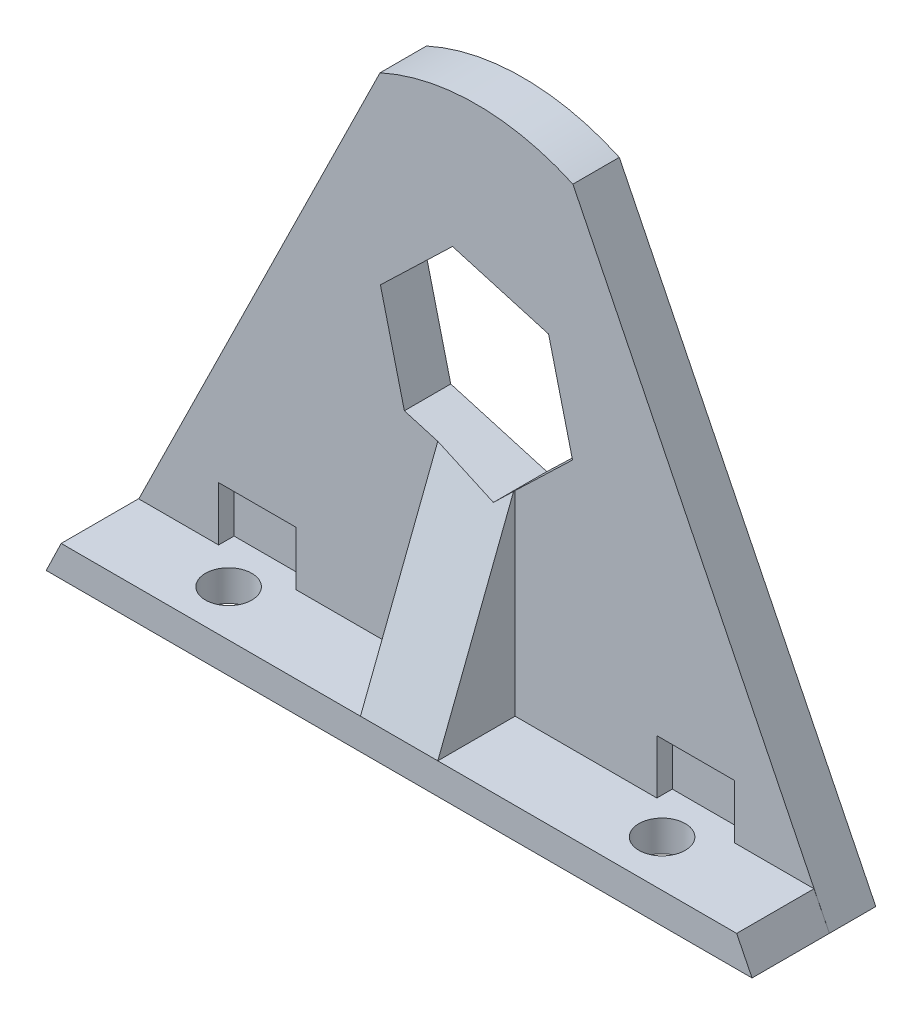
ISO-10303-21;
HEADER;
FILE_DESCRIPTION(('STEP AP214'),'2;1');
FILE_NAME('part.step','',(''),(''),'','','');
FILE_SCHEMA(('AUTOMOTIVE_DESIGN { 1 0 10303 214 1 1 1 1 }'));
ENDSEC;
DATA;
#1=APPLICATION_CONTEXT('core data for automotive mechanical design processes');
#2=APPLICATION_PROTOCOL_DEFINITION('international standard','automotive_design',2000,#1);
#3=PRODUCT_CONTEXT('',#1,'mechanical');
#4=PRODUCT('Part','Part','',(#3));
#5=PRODUCT_RELATED_PRODUCT_CATEGORY('part','',(#4));
#6=PRODUCT_DEFINITION_FORMATION('','',#4);
#7=PRODUCT_DEFINITION_CONTEXT('part definition',#1,'design');
#8=PRODUCT_DEFINITION('design','',#6,#7);
#9=PRODUCT_DEFINITION_SHAPE('','',#8);
#10=(LENGTH_UNIT() NAMED_UNIT(*) SI_UNIT(.MILLI.,.METRE.));
#11=(NAMED_UNIT(*) PLANE_ANGLE_UNIT() SI_UNIT($,.RADIAN.));
#12=(NAMED_UNIT(*) SI_UNIT($,.STERADIAN.) SOLID_ANGLE_UNIT());
#13=UNCERTAINTY_MEASURE_WITH_UNIT(LENGTH_MEASURE(1.E-05),#10,'distance_accuracy_value','');
#14=(GEOMETRIC_REPRESENTATION_CONTEXT(3) GLOBAL_UNCERTAINTY_ASSIGNED_CONTEXT((#13)) GLOBAL_UNIT_ASSIGNED_CONTEXT((#10,
#11,#12)) REPRESENTATION_CONTEXT('',''));
#15=CARTESIAN_POINT('',(0.,0.,0.));
#16=DIRECTION('',(0.,0.,1.));
#17=DIRECTION('',(1.,0.,0.));
#18=AXIS2_PLACEMENT_3D('',#15,#16,#17);
#19=CARTESIAN_POINT('',(0.,0.,0.));
#20=DIRECTION('',(0.,0.,1.));
#21=DIRECTION('',(1.,0.,0.));
#22=AXIS2_PLACEMENT_3D('',#19,#20,#21);
#23=PLANE('',#22);
#24=DIRECTION('',(0.960575743858647,-0.278018417214413,0.));
#25=VECTOR('',#24,1.);
#26=CARTESIAN_POINT('',(-4.66259965644607,-17.2203457207053,0.));
#27=LINE('',#26,#25);
#28=CARTESIAN_POINT('',(-4.66259965644607,-17.2203457207053,0.));
#29=VERTEX_POINT('',#28);
#30=CARTESIAN_POINT('',(1.54879338364465,-19.0181026105115,0.));
#31=VERTEX_POINT('',#30);
#32=EDGE_CURVE('E311',#29,#31,#27,.T.);
#33=ORIENTED_EDGE('',*,*,#32,.T.);
#34=DIRECTION('',(0.721058883956946,0.692873787833516,0.));
#35=VECTOR('',#34,1.);
#36=CARTESIAN_POINT('',(1.54879338364465,-19.0181026105115,0.));
#37=LINE('',#36,#35);
#38=CARTESIAN_POINT('',(6.21139304009072,-14.5377568898062,0.));
#39=VERTEX_POINT('',#38);
#40=EDGE_CURVE('E296',#31,#39,#37,.T.);
#41=ORIENTED_EDGE('',*,*,#40,.T.);
#42=DIRECTION('',(-0.239516859901701,0.970892205047929,0.));
#43=VECTOR('',#42,1.);
#44=CARTESIAN_POINT('',(6.21139304009072,-14.5377568898062,0.));
#45=LINE('',#44,#43);
#46=CARTESIAN_POINT('',(4.66259965644607,-8.25965427929471,0.));
#47=VERTEX_POINT('',#46);
#48=EDGE_CURVE('E299',#39,#47,#45,.T.);
#49=ORIENTED_EDGE('',*,*,#48,.T.);
#50=DIRECTION('',(-0.960575743858647,0.278018417214413,0.));
#51=VECTOR('',#50,1.);
#52=CARTESIAN_POINT('',(4.66259965644607,-8.25965427929471,0.));
#53=LINE('',#52,#51);
#54=CARTESIAN_POINT('',(-1.54879338364465,-6.46189738948846,0.));
#55=VERTEX_POINT('',#54);
#56=EDGE_CURVE('E302',#47,#55,#53,.T.);
#57=ORIENTED_EDGE('',*,*,#56,.T.);
#58=DIRECTION('',(-0.721058883956946,-0.692873787833516,0.));
#59=VECTOR('',#58,1.);
#60=CARTESIAN_POINT('',(-1.54879338364465,-6.46189738948846,0.));
#61=LINE('',#60,#59);
#62=CARTESIAN_POINT('',(-6.21139304009072,-10.9422431101938,0.));
#63=VERTEX_POINT('',#62);
#64=EDGE_CURVE('E305',#55,#63,#61,.T.);
#65=ORIENTED_EDGE('',*,*,#64,.T.);
#66=DIRECTION('',(0.239516859901701,-0.970892205047929,0.));
#67=VECTOR('',#66,1.);
#68=CARTESIAN_POINT('',(-6.21139304009072,-10.9422431101938,0.));
#69=LINE('',#68,#67);
#70=EDGE_CURVE('E308',#63,#29,#69,.T.);
#71=ORIENTED_EDGE('',*,*,#70,.T.);
#72=EDGE_LOOP('',(#33,#41,#49,#57,#65,#71));
#73=FACE_BOUND('',#72,.T.);
#74=DIRECTION('',(-0.441971259606871,-0.897029211164004,0.));
#75=VECTOR('',#74,1.);
#76=CARTESIAN_POINT('',(-5.38217526698402,2.65182755764123,0.));
#77=LINE('',#76,#75);
#78=CARTESIAN_POINT('',(-6.23517921956288,0.920562354147691,0.));
#79=VERTEX_POINT('',#78);
#80=CARTESIAN_POINT('',(-22.8199246855813,-32.74,0.));
#81=VERTEX_POINT('',#80);
#82=EDGE_CURVE('E409',#79,#81,#77,.T.);
#83=ORIENTED_EDGE('',*,*,#82,.F.);
#84=CARTESIAN_POINT('',(0.,-12.74,0.));
#85=DIRECTION('',(0.,0.,1.));
#86=DIRECTION('',(1.,0.,0.));
#87=AXIS2_PLACEMENT_3D('',#84,#85,#86);
#88=CIRCLE('',#87,15.0162719651592);
#89=CARTESIAN_POINT('',(6.23517921956288,0.920562354147692,0.));
#90=VERTEX_POINT('',#89);
#91=EDGE_CURVE('E293',#79,#90,#88,.F.);
#92=ORIENTED_EDGE('',*,*,#91,.T.);
#93=DIRECTION('',(-0.441971259606872,0.897029211164004,0.));
#94=VECTOR('',#93,1.);
#95=CARTESIAN_POINT('',(5.38217526698402,2.65182755764123,0.));
#96=LINE('',#95,#94);
#97=CARTESIAN_POINT('',(22.8199246855813,-32.74,0.));
#98=VERTEX_POINT('',#97);
#99=EDGE_CURVE('E401',#98,#90,#96,.T.);
#100=ORIENTED_EDGE('',*,*,#99,.F.);
#101=DIRECTION('',(1.,0.,0.));
#102=VECTOR('',#101,1.);
#103=CARTESIAN_POINT('',(-22.8199246855813,-32.74,0.));
#104=LINE('',#103,#102);
#105=EDGE_CURVE('E406',#81,#98,#104,.T.);
#106=ORIENTED_EDGE('',*,*,#105,.F.);
#107=EDGE_LOOP('',(#83,#92,#100,#106));
#108=FACE_BOUND('',#107,.T.);
#109=ADVANCED_FACE('F40',(#73,#108),#23,.F.);
#110=CARTESIAN_POINT('',(21.8241930023884,-30.74,8.));
#111=DIRECTION('',(-0.895190076131968,-0.445684560642212,0.));
#112=DIRECTION('',(0.445684560642212,-0.895190076131968,0.));
#113=AXIS2_PLACEMENT_3D('',#110,#111,#112);
#114=PLANE('',#113);
#115=DIRECTION('',(0.445684560642212,-0.895190076131968,0.));
#116=VECTOR('',#115,1.);
#117=CARTESIAN_POINT('',(21.8241930023884,-30.74,3.));
#118=LINE('',#117,#116);
#119=CARTESIAN_POINT('',(21.8241930023884,-30.74,3.));
#120=VERTEX_POINT('',#119);
#121=CARTESIAN_POINT('',(22.8199246855813,-32.74,3.));
#122=VERTEX_POINT('',#121);
#123=EDGE_CURVE('E364',#120,#122,#118,.T.);
#124=ORIENTED_EDGE('',*,*,#123,.F.);
#125=DIRECTION('',(0.,0.,-1.));
#126=VECTOR('',#125,1.);
#127=CARTESIAN_POINT('',(21.8241930023884,-30.74,8.));
#128=LINE('',#127,#126);
#129=CARTESIAN_POINT('',(21.8241930023884,-30.74,8.));
#130=VERTEX_POINT('',#129);
#131=EDGE_CURVE('E394',#130,#120,#128,.T.);
#132=ORIENTED_EDGE('',*,*,#131,.F.);
#133=DIRECTION('',(-0.445684560642212,0.895190076131968,0.));
#134=VECTOR('',#133,1.);
#135=CARTESIAN_POINT('',(21.8241930023884,-30.74,8.));
#136=LINE('',#135,#134);
#137=CARTESIAN_POINT('',(22.8199246855813,-32.74,8.));
#138=VERTEX_POINT('',#137);
#139=EDGE_CURVE('E382',#138,#130,#136,.T.);
#140=ORIENTED_EDGE('',*,*,#139,.F.);
#141=DIRECTION('',(0.,0.,-1.));
#142=VECTOR('',#141,1.);
#143=CARTESIAN_POINT('',(22.8199246855813,-32.74,8.));
#144=LINE('',#143,#142);
#145=EDGE_CURVE('E396',#138,#122,#144,.T.);
#146=ORIENTED_EDGE('',*,*,#145,.T.);
#147=EDGE_LOOP('',(#124,#132,#140,#146));
#148=FACE_BOUND('',#147,.T.);
#149=ADVANCED_FACE('F470',(#148),#114,.F.);
#150=CARTESIAN_POINT('',(-21.8516656723651,-30.74,8.));
#151=DIRECTION('',(0.,-1.,0.));
#152=DIRECTION('',(0.,0.,-1.));
#153=AXIS2_PLACEMENT_3D('',#150,#151,#152);
#154=PLANE('',#153);
#155=CARTESIAN_POINT('',(14.0138484452087,-30.74,5.01113147451422));
#156=DIRECTION('',(0.,-1.,0.));
#157=DIRECTION('',(0.,0.,-1.));
#158=AXIS2_PLACEMENT_3D('',#155,#156,#157);
#159=CIRCLE('',#158,1.5);
#160=CARTESIAN_POINT('',(14.0138484452087,-30.74,3.51113147451422));
#161=VERTEX_POINT('',#160);
#162=EDGE_CURVE('E283',#161,#161,#159,.T.);
#163=ORIENTED_EDGE('',*,*,#162,.T.);
#164=EDGE_LOOP('',(#163));
#165=FACE_BOUND('',#164,.T.);
#166=DIRECTION('',(1.,0.,0.));
#167=VECTOR('',#166,1.);
#168=CARTESIAN_POINT('',(-21.8516656723651,-30.74,3.));
#169=LINE('',#168,#167);
#170=CARTESIAN_POINT('',(2.5,-30.74,3.));
#171=VERTEX_POINT('',#170);
#172=CARTESIAN_POINT('',(11.6629495542711,-30.74,3.));
#173=VERTEX_POINT('',#172);
#174=EDGE_CURVE('E361',#171,#173,#169,.T.);
#175=ORIENTED_EDGE('',*,*,#174,.F.);
#176=DIRECTION('',(0.,0.,1.));
#177=VECTOR('',#176,1.);
#178=CARTESIAN_POINT('',(2.5,-30.74,8.));
#179=LINE('',#178,#177);
#180=CARTESIAN_POINT('',(2.5,-30.74,8.));
#181=VERTEX_POINT('',#180);
#182=EDGE_CURVE('E372',#171,#181,#179,.T.);
#183=ORIENTED_EDGE('',*,*,#182,.T.);
#184=DIRECTION('',(-1.,0.,0.));
#185=VECTOR('',#184,1.);
#186=CARTESIAN_POINT('',(-21.8516656723651,-30.74,8.));
#187=LINE('',#186,#185);
#188=EDGE_CURVE('E385',#130,#181,#187,.T.);
#189=ORIENTED_EDGE('',*,*,#188,.F.);
#190=ORIENTED_EDGE('',*,*,#131,.T.);
#191=CARTESIAN_POINT('',(16.6740539143788,-30.74,3.));
#192=VERTEX_POINT('',#191);
#193=EDGE_CURVE('E216',#192,#120,#169,.T.);
#194=ORIENTED_EDGE('',*,*,#193,.F.);
#195=DIRECTION('',(0.,0.,1.));
#196=VECTOR('',#195,1.);
#197=CARTESIAN_POINT('',(16.6740539143788,-30.74,2.));
#198=LINE('',#197,#196);
#199=CARTESIAN_POINT('',(16.6740539143788,-30.74,2.));
#200=VERTEX_POINT('',#199);
#201=EDGE_CURVE('E55',#200,#192,#198,.T.);
#202=ORIENTED_EDGE('',*,*,#201,.F.);
#203=DIRECTION('',(1.,0.,0.));
#204=VECTOR('',#203,1.);
#205=CARTESIAN_POINT('',(16.6740539143788,-30.74,2.));
#206=LINE('',#205,#204);
#207=CARTESIAN_POINT('',(11.6629495542711,-30.74,2.));
#208=VERTEX_POINT('',#207);
#209=EDGE_CURVE('E213',#208,#200,#206,.T.);
#210=ORIENTED_EDGE('',*,*,#209,.F.);
#211=DIRECTION('',(0.,0.,1.));
#212=VECTOR('',#211,1.);
#213=CARTESIAN_POINT('',(11.6629495542711,-30.74,2.));
#214=LINE('',#213,#212);
#215=EDGE_CURVE('E242',#208,#173,#214,.T.);
#216=ORIENTED_EDGE('',*,*,#215,.T.);
#217=EDGE_LOOP('',(#175,#183,#189,#190,#194,#202,#210,#216));
#218=FACE_BOUND('',#217,.T.);
#219=ADVANCED_FACE('F211',(#165,#218),#154,.F.);
#220=CARTESIAN_POINT('',(2.5,-13.37,4.));
#221=DIRECTION('',(1.,0.,0.));
#222=DIRECTION('',(0.,0.,-1.));
#223=AXIS2_PLACEMENT_3D('',#220,#221,#222);
#224=PLANE('',#223);
#225=DIRECTION('',(0.,0.93235184345378,-0.361552264559825));
#226=VECTOR('',#225,1.);
#227=CARTESIAN_POINT('',(2.5,-14.2922314134759,1.62179844318767));
#228=LINE('',#227,#226);
#229=CARTESIAN_POINT('',(2.5,-18.1040772154291,3.09997590540382));
#230=VERTEX_POINT('',#229);
#231=EDGE_CURVE('E291',#181,#230,#228,.T.);
#232=ORIENTED_EDGE('',*,*,#231,.F.);
#233=ORIENTED_EDGE('',*,*,#182,.F.);
#234=DIRECTION('',(0.,1.,0.));
#235=VECTOR('',#234,1.);
#236=CARTESIAN_POINT('',(2.5,-13.37,3.));
#237=LINE('',#236,#235);
#238=CARTESIAN_POINT('',(2.5,-18.1040772154291,3.));
#239=VERTEX_POINT('',#238);
#240=EDGE_CURVE('E358',#171,#239,#237,.T.);
#241=ORIENTED_EDGE('',*,*,#240,.T.);
#242=DIRECTION('',(0.,0.,-1.));
#243=VECTOR('',#242,1.);
#244=CARTESIAN_POINT('',(2.5,-18.1040772154291,4.));
#245=LINE('',#244,#243);
#246=EDGE_CURVE('E317',#230,#239,#245,.T.);
#247=ORIENTED_EDGE('',*,*,#246,.F.);
#248=EDGE_LOOP('',(#232,#233,#241,#247));
#249=FACE_BOUND('',#248,.T.);
#250=ADVANCED_FACE('F458',(#249),#224,.T.);
#251=CARTESIAN_POINT('',(-2.5,-13.37,4.));
#252=DIRECTION('',(1.,0.,0.));
#253=DIRECTION('',(0.,0.,-1.));
#254=AXIS2_PLACEMENT_3D('',#251,#252,#253);
#255=PLANE('',#254);
#256=DIRECTION('',(0.,0.,1.));
#257=VECTOR('',#256,1.);
#258=CARTESIAN_POINT('',(-2.5,-30.74,8.));
#259=LINE('',#258,#257);
#260=CARTESIAN_POINT('',(-2.5,-30.74,3.));
#261=VERTEX_POINT('',#260);
#262=CARTESIAN_POINT('',(-2.5,-30.74,8.));
#263=VERTEX_POINT('',#262);
#264=EDGE_CURVE('E369',#261,#263,#259,.T.);
#265=ORIENTED_EDGE('',*,*,#264,.T.);
#266=DIRECTION('',(0.,-0.93235184345378,0.361552264559825));
#267=VECTOR('',#266,1.);
#268=CARTESIAN_POINT('',(-2.5,-17.8462646421413,3.));
#269=LINE('',#268,#267);
#270=CARTESIAN_POINT('',(-2.5,-17.8462646421413,3.));
#271=VERTEX_POINT('',#270);
#272=EDGE_CURVE('E286',#271,#263,#269,.T.);
#273=ORIENTED_EDGE('',*,*,#272,.F.);
#274=DIRECTION('',(0.,1.,0.));
#275=VECTOR('',#274,1.);
#276=CARTESIAN_POINT('',(-2.5,-13.37,3.));
#277=LINE('',#276,#275);
#278=EDGE_CURVE('E48',#261,#271,#277,.T.);
#279=ORIENTED_EDGE('',*,*,#278,.F.);
#280=EDGE_LOOP('',(#265,#273,#279));
#281=FACE_BOUND('',#280,.T.);
#282=ADVANCED_FACE('F508',(#281),#255,.F.);
#283=CARTESIAN_POINT('',(-14.0138479574089,-30.74,5.01113147451422));
#284=DIRECTION('',(0.,-1.,0.));
#285=DIRECTION('',(0.,0.,-1.));
#286=AXIS2_PLACEMENT_3D('',#283,#284,#285);
#287=CIRCLE('',#286,1.5);
#288=CARTESIAN_POINT('',(-14.0138479574089,-30.74,3.51113147451422));
#289=VERTEX_POINT('',#288);
#290=EDGE_CURVE('E277',#289,#289,#287,.T.);
#291=ORIENTED_EDGE('',*,*,#290,.T.);
#292=EDGE_LOOP('',(#291));
#293=FACE_BOUND('',#292,.T.);
#294=DIRECTION('',(1.,0.,0.));
#295=VECTOR('',#294,1.);
#296=CARTESIAN_POINT('',(-21.8516656723651,-30.74,3.));
#297=LINE('',#296,#295);
#298=CARTESIAN_POINT('',(-21.8345136106546,-30.74,3.));
#299=VERTEX_POINT('',#298);
#300=CARTESIAN_POINT('',(-16.6740539143788,-30.74,3.));
#301=VERTEX_POINT('',#300);
#302=EDGE_CURVE('E355',#299,#301,#297,.T.);
#303=ORIENTED_EDGE('',*,*,#302,.F.);
#304=DIRECTION('',(0.,0.,-1.));
#305=VECTOR('',#304,1.);
#306=CARTESIAN_POINT('',(-21.8345136106546,-30.74,8.));
#307=LINE('',#306,#305);
#308=CARTESIAN_POINT('',(-21.8345136106546,-30.74,2.));
#309=VERTEX_POINT('',#308);
#310=EDGE_CURVE('E367',#299,#309,#307,.T.);
#311=ORIENTED_EDGE('',*,*,#310,.T.);
#312=DIRECTION('',(-1.,0.,0.));
#313=VECTOR('',#312,1.);
#314=CARTESIAN_POINT('',(-21.8516656723651,-30.74,2.));
#315=LINE('',#314,#313);
#316=CARTESIAN_POINT('',(-21.8516656723651,-30.74,2.));
#317=VERTEX_POINT('',#316);
#318=EDGE_CURVE('E380',#309,#317,#315,.T.);
#319=ORIENTED_EDGE('',*,*,#318,.T.);
#320=DIRECTION('',(0.,0.,-1.));
#321=VECTOR('',#320,1.);
#322=CARTESIAN_POINT('',(-21.8516656723651,-30.74,8.));
#323=LINE('',#322,#321);
#324=CARTESIAN_POINT('',(-21.8516656723651,-30.74,8.));
#325=VERTEX_POINT('',#324);
#326=EDGE_CURVE('E387',#325,#317,#323,.T.);
#327=ORIENTED_EDGE('',*,*,#326,.F.);
#328=EDGE_CURVE('E384',#263,#325,#187,.T.);
#329=ORIENTED_EDGE('',*,*,#328,.F.);
#330=ORIENTED_EDGE('',*,*,#264,.F.);
#331=CARTESIAN_POINT('',(-11.6629495542711,-30.74,3.));
#332=VERTEX_POINT('',#331);
#333=EDGE_CURVE('E343',#332,#261,#297,.T.);
#334=ORIENTED_EDGE('',*,*,#333,.F.);
#335=DIRECTION('',(0.,0.,1.));
#336=VECTOR('',#335,1.);
#337=CARTESIAN_POINT('',(-11.6629495542711,-30.74,2.));
#338=LINE('',#337,#336);
#339=CARTESIAN_POINT('',(-11.6629495542711,-30.74,2.));
#340=VERTEX_POINT('',#339);
#341=EDGE_CURVE('E272',#340,#332,#338,.T.);
#342=ORIENTED_EDGE('',*,*,#341,.F.);
#343=DIRECTION('',(1.,0.,0.));
#344=VECTOR('',#343,1.);
#345=CARTESIAN_POINT('',(-16.6740539143788,-30.74,2.));
#346=LINE('',#345,#344);
#347=CARTESIAN_POINT('',(-16.6740539143788,-30.74,2.));
#348=VERTEX_POINT('',#347);
#349=EDGE_CURVE('E250',#348,#340,#346,.T.);
#350=ORIENTED_EDGE('',*,*,#349,.F.);
#351=DIRECTION('',(0.,0.,1.));
#352=VECTOR('',#351,1.);
#353=CARTESIAN_POINT('',(-16.6740539143788,-30.74,2.));
#354=LINE('',#353,#352);
#355=EDGE_CURVE('E260',#348,#301,#354,.T.);
#356=ORIENTED_EDGE('',*,*,#355,.T.);
#357=EDGE_LOOP('',(#303,#311,#319,#327,#329,#330,#334,#342,#350,#356));
#358=FACE_BOUND('',#357,.T.);
#359=ADVANCED_FACE('F493',(#293,#358),#154,.F.);
#360=CARTESIAN_POINT('',(5.38217526698402,2.65182755764123,2.));
#361=DIRECTION('',(-0.897029211164004,-0.441971259606872,0.));
#362=DIRECTION('',(0.441971259606872,-0.897029211164004,0.));
#363=AXIS2_PLACEMENT_3D('',#360,#361,#362);
#364=PLANE('',#363);
#365=ORIENTED_EDGE('',*,*,#99,.T.);
#366=DIRECTION('',(0.,0.,-1.));
#367=VECTOR('',#366,1.);
#368=CARTESIAN_POINT('',(6.23517921956288,0.920562354147694,3.));
#369=LINE('',#368,#367);
#370=CARTESIAN_POINT('',(6.23517921956288,0.920562354147694,3.));
#371=VERTEX_POINT('',#370);
#372=EDGE_CURVE('E341',#371,#90,#369,.T.);
#373=ORIENTED_EDGE('',*,*,#372,.F.);
#374=DIRECTION('',(0.441971259606872,-0.897029211164004,0.));
#375=VECTOR('',#374,1.);
#376=CARTESIAN_POINT('',(5.38217526698402,2.65182755764123,3.));
#377=LINE('',#376,#375);
#378=EDGE_CURVE('E337',#371,#122,#377,.T.);
#379=ORIENTED_EDGE('',*,*,#378,.T.);
#380=DIRECTION('',(0.,0.,-1.));
#381=VECTOR('',#380,1.);
#382=CARTESIAN_POINT('',(22.8199246855813,-32.74,2.));
#383=LINE('',#382,#381);
#384=EDGE_CURVE('E405',#122,#98,#383,.T.);
#385=ORIENTED_EDGE('',*,*,#384,.T.);
#386=EDGE_LOOP('',(#365,#373,#379,#385));
#387=FACE_BOUND('',#386,.T.);
#388=ADVANCED_FACE('F42',(#387),#364,.F.);
#389=CARTESIAN_POINT('',(-5.38217526698402,2.65182755764123,2.));
#390=DIRECTION('',(0.897029211164004,-0.441971259606871,0.));
#391=DIRECTION('',(0.441971259606871,0.897029211164004,0.));
#392=AXIS2_PLACEMENT_3D('',#389,#390,#391);
#393=PLANE('',#392);
#394=DIRECTION('',(0.,0.,-1.));
#395=VECTOR('',#394,1.);
#396=CARTESIAN_POINT('',(-6.23517921956288,0.920562354147695,3.));
#397=LINE('',#396,#395);
#398=CARTESIAN_POINT('',(-6.23517921956288,0.920562354147695,3.));
#399=VERTEX_POINT('',#398);
#400=EDGE_CURVE('E344',#399,#79,#397,.T.);
#401=ORIENTED_EDGE('',*,*,#400,.T.);
#402=ORIENTED_EDGE('',*,*,#82,.T.);
#403=DIRECTION('',(0.,0.,-1.));
#404=VECTOR('',#403,1.);
#405=CARTESIAN_POINT('',(-22.8199246855813,-32.74,2.));
#406=LINE('',#405,#404);
#407=CARTESIAN_POINT('',(-22.8199246855813,-32.74,2.));
#408=VERTEX_POINT('',#407);
#409=EDGE_CURVE('E414',#408,#81,#406,.T.);
#410=ORIENTED_EDGE('',*,*,#409,.F.);
#411=DIRECTION('',(-0.441971259606871,-0.897029211164004,0.));
#412=VECTOR('',#411,1.);
#413=CARTESIAN_POINT('',(-5.38217526698402,2.65182755764123,2.));
#414=LINE('',#413,#412);
#415=EDGE_CURVE('E402',#309,#408,#414,.T.);
#416=ORIENTED_EDGE('',*,*,#415,.F.);
#417=ORIENTED_EDGE('',*,*,#310,.F.);
#418=DIRECTION('',(0.441971259606871,0.897029211164004,0.));
#419=VECTOR('',#418,1.);
#420=CARTESIAN_POINT('',(-5.38217526698402,2.65182755764123,3.));
#421=LINE('',#420,#419);
#422=EDGE_CURVE('E332',#299,#399,#421,.T.);
#423=ORIENTED_EDGE('',*,*,#422,.T.);
#424=EDGE_LOOP('',(#401,#402,#410,#416,#417,#423));
#425=FACE_BOUND('',#424,.T.);
#426=ADVANCED_FACE('F488',(#425),#393,.F.);
#427=CARTESIAN_POINT('',(-22.8199246855813,-32.74,2.));
#428=DIRECTION('',(0.,1.,0.));
#429=DIRECTION('',(0.,0.,1.));
#430=AXIS2_PLACEMENT_3D('',#427,#428,#429);
#431=PLANE('',#430);
#432=CARTESIAN_POINT('',(-14.0138479574089,-32.74,5.01113147451422));
#433=DIRECTION('',(0.,-1.,0.));
#434=DIRECTION('',(0.,0.,-1.));
#435=AXIS2_PLACEMENT_3D('',#432,#433,#434);
#436=CIRCLE('',#435,1.5);
#437=CARTESIAN_POINT('',(-14.0138479574089,-32.74,3.51113147451422));
#438=VERTEX_POINT('',#437);
#439=EDGE_CURVE('E269',#438,#438,#436,.T.);
#440=ORIENTED_EDGE('',*,*,#439,.F.);
#441=EDGE_LOOP('',(#440));
#442=FACE_BOUND('',#441,.T.);
#443=CARTESIAN_POINT('',(14.0138484452087,-32.74,5.01113147451422));
#444=DIRECTION('',(0.,-1.,0.));
#445=DIRECTION('',(0.,0.,-1.));
#446=AXIS2_PLACEMENT_3D('',#443,#444,#445);
#447=CIRCLE('',#446,1.5);
#448=CARTESIAN_POINT('',(14.0138484452087,-32.74,3.51113147451422));
#449=VERTEX_POINT('',#448);
#450=EDGE_CURVE('E280',#449,#449,#447,.T.);
#451=ORIENTED_EDGE('',*,*,#450,.F.);
#452=EDGE_LOOP('',(#451));
#453=FACE_BOUND('',#452,.T.);
#454=ORIENTED_EDGE('',*,*,#384,.F.);
#455=ORIENTED_EDGE('',*,*,#145,.F.);
#456=DIRECTION('',(1.,0.,0.));
#457=VECTOR('',#456,1.);
#458=CARTESIAN_POINT('',(-22.8199246855813,-32.74,8.));
#459=LINE('',#458,#457);
#460=CARTESIAN_POINT('',(-22.8199246855813,-32.74,8.));
#461=VERTEX_POINT('',#460);
#462=EDGE_CURVE('E379',#461,#138,#459,.T.);
#463=ORIENTED_EDGE('',*,*,#462,.F.);
#464=DIRECTION('',(0.,0.,-1.));
#465=VECTOR('',#464,1.);
#466=CARTESIAN_POINT('',(-22.8199246855813,-32.74,8.));
#467=LINE('',#466,#465);
#468=EDGE_CURVE('E399',#461,#408,#467,.T.);
#469=ORIENTED_EDGE('',*,*,#468,.T.);
#470=ORIENTED_EDGE('',*,*,#409,.T.);
#471=ORIENTED_EDGE('',*,*,#105,.T.);
#472=EDGE_LOOP('',(#454,#455,#463,#469,#470,#471));
#473=FACE_BOUND('',#472,.T.);
#474=ADVANCED_FACE('F474',(#442,#453,#473),#431,.F.);
#475=CARTESIAN_POINT('',(0.,0.,2.));
#476=DIRECTION('',(0.,0.,1.));
#477=DIRECTION('',(1.,0.,0.));
#478=AXIS2_PLACEMENT_3D('',#475,#476,#477);
#479=PLANE('',#478);
#480=ORIENTED_EDGE('',*,*,#318,.F.);
#481=ORIENTED_EDGE('',*,*,#415,.T.);
#482=DIRECTION('',(-0.435749474332028,-0.900067994997801,0.));
#483=VECTOR('',#482,1.);
#484=CARTESIAN_POINT('',(-21.8516656723651,-30.74,2.));
#485=LINE('',#484,#483);
#486=EDGE_CURVE('E375',#317,#408,#485,.T.);
#487=ORIENTED_EDGE('',*,*,#486,.F.);
#488=EDGE_LOOP('',(#480,#481,#487));
#489=FACE_BOUND('',#488,.T.);
#490=ADVANCED_FACE('F520',(#489),#479,.F.);
#491=CARTESIAN_POINT('',(-21.8516656723651,-30.74,8.));
#492=DIRECTION('',(0.900067994997801,-0.435749474332028,0.));
#493=DIRECTION('',(0.435749474332027,0.900067994997801,0.));
#494=AXIS2_PLACEMENT_3D('',#491,#492,#493);
#495=PLANE('',#494);
#496=ORIENTED_EDGE('',*,*,#486,.T.);
#497=ORIENTED_EDGE('',*,*,#468,.F.);
#498=DIRECTION('',(-0.435749474332028,-0.900067994997801,0.));
#499=VECTOR('',#498,1.);
#500=CARTESIAN_POINT('',(-21.8516656723651,-30.74,8.));
#501=LINE('',#500,#499);
#502=EDGE_CURVE('E376',#325,#461,#501,.T.);
#503=ORIENTED_EDGE('',*,*,#502,.F.);
#504=ORIENTED_EDGE('',*,*,#326,.T.);
#505=EDGE_LOOP('',(#496,#497,#503,#504));
#506=FACE_BOUND('',#505,.T.);
#507=ADVANCED_FACE('F518',(#506),#495,.F.);
#508=CARTESIAN_POINT('',(0.,0.,8.));
#509=DIRECTION('',(0.,0.,1.));
#510=DIRECTION('',(1.,0.,0.));
#511=AXIS2_PLACEMENT_3D('',#508,#509,#510);
#512=PLANE('',#511);
#513=ORIENTED_EDGE('',*,*,#188,.T.);
#514=EDGE_CURVE('E388',#181,#263,#187,.T.);
#515=ORIENTED_EDGE('',*,*,#514,.T.);
#516=ORIENTED_EDGE('',*,*,#328,.T.);
#517=ORIENTED_EDGE('',*,*,#502,.T.);
#518=ORIENTED_EDGE('',*,*,#462,.T.);
#519=ORIENTED_EDGE('',*,*,#139,.T.);
#520=EDGE_LOOP('',(#513,#515,#516,#517,#518,#519));
#521=FACE_BOUND('',#520,.T.);
#522=ADVANCED_FACE('F513',(#521),#512,.T.);
#523=CARTESIAN_POINT('',(0.,0.,3.));
#524=DIRECTION('',(0.,0.,-1.));
#525=DIRECTION('',(-1.,0.,0.));
#526=AXIS2_PLACEMENT_3D('',#523,#524,#525);
#527=PLANE('',#526);
#528=ORIENTED_EDGE('',*,*,#174,.T.);
#529=DIRECTION('',(0.,-1.,0.));
#530=VECTOR('',#529,1.);
#531=CARTESIAN_POINT('',(11.6629495542711,-30.74,3.));
#532=LINE('',#531,#530);
#533=CARTESIAN_POINT('',(11.6629495542711,-27.2457124791288,3.));
#534=VERTEX_POINT('',#533);
#535=EDGE_CURVE('E230',#534,#173,#532,.T.);
#536=ORIENTED_EDGE('',*,*,#535,.F.);
#537=DIRECTION('',(-1.,0.,0.));
#538=VECTOR('',#537,1.);
#539=CARTESIAN_POINT('',(16.6740539143788,-27.2457124791288,3.));
#540=LINE('',#539,#538);
#541=CARTESIAN_POINT('',(16.6740539143788,-27.2457124791288,3.));
#542=VERTEX_POINT('',#541);
#543=EDGE_CURVE('E233',#542,#534,#540,.T.);
#544=ORIENTED_EDGE('',*,*,#543,.F.);
#545=DIRECTION('',(0.,1.,0.));
#546=VECTOR('',#545,1.);
#547=CARTESIAN_POINT('',(16.6740539143788,-30.74,3.));
#548=LINE('',#547,#546);
#549=EDGE_CURVE('E238',#192,#542,#548,.T.);
#550=ORIENTED_EDGE('',*,*,#549,.F.);
#551=ORIENTED_EDGE('',*,*,#193,.T.);
#552=ORIENTED_EDGE('',*,*,#123,.T.);
#553=ORIENTED_EDGE('',*,*,#378,.F.);
#554=CARTESIAN_POINT('',(0.,-12.74,3.));
#555=DIRECTION('',(0.,0.,-1.));
#556=DIRECTION('',(-1.,0.,0.));
#557=AXIS2_PLACEMENT_3D('',#554,#555,#556);
#558=CIRCLE('',#557,15.0162719651592);
#559=EDGE_CURVE('E334',#399,#371,#558,.T.);
#560=ORIENTED_EDGE('',*,*,#559,.F.);
#561=ORIENTED_EDGE('',*,*,#422,.F.);
#562=ORIENTED_EDGE('',*,*,#302,.T.);
#563=DIRECTION('',(0.,-1.,0.));
#564=VECTOR('',#563,1.);
#565=CARTESIAN_POINT('',(-16.6740539143788,-30.74,3.));
#566=LINE('',#565,#564);
#567=CARTESIAN_POINT('',(-16.6740539143788,-27.2457124791288,3.));
#568=VERTEX_POINT('',#567);
#569=EDGE_CURVE('E63',#568,#301,#566,.T.);
#570=ORIENTED_EDGE('',*,*,#569,.F.);
#571=DIRECTION('',(-1.,0.,0.));
#572=VECTOR('',#571,1.);
#573=CARTESIAN_POINT('',(-16.6740539143788,-27.2457124791288,3.));
#574=LINE('',#573,#572);
#575=CARTESIAN_POINT('',(-11.6629495542711,-27.2457124791288,3.));
#576=VERTEX_POINT('',#575);
#577=EDGE_CURVE('E251',#576,#568,#574,.T.);
#578=ORIENTED_EDGE('',*,*,#577,.F.);
#579=DIRECTION('',(0.,1.,0.));
#580=VECTOR('',#579,1.);
#581=CARTESIAN_POINT('',(-11.6629495542711,-30.74,3.));
#582=LINE('',#581,#580);
#583=EDGE_CURVE('E262',#332,#576,#582,.T.);
#584=ORIENTED_EDGE('',*,*,#583,.F.);
#585=ORIENTED_EDGE('',*,*,#333,.T.);
#586=ORIENTED_EDGE('',*,*,#278,.T.);
#587=DIRECTION('',(-0.960575743858645,0.27801841721442,0.));
#588=VECTOR('',#587,1.);
#589=CARTESIAN_POINT('',(-4.95921884492887,-17.1344955440538,3.));
#590=LINE('',#589,#588);
#591=CARTESIAN_POINT('',(-4.66259965644611,-17.2203457207053,3.));
#592=VERTEX_POINT('',#591);
#593=EDGE_CURVE('E320',#271,#592,#590,.T.);
#594=ORIENTED_EDGE('',*,*,#593,.T.);
#595=DIRECTION('',(-0.239516859901694,0.97089220504793,0.));
#596=VECTOR('',#595,1.);
#597=CARTESIAN_POINT('',(-8.39962031401127,-2.0721668909466,3.));
#598=LINE('',#597,#596);
#599=CARTESIAN_POINT('',(-6.21139304009071,-10.9422431101937,3.));
#600=VERTEX_POINT('',#599);
#601=EDGE_CURVE('E330',#592,#600,#598,.T.);
#602=ORIENTED_EDGE('',*,*,#601,.T.);
#603=DIRECTION('',(0.721058883956951,0.69287378783351,0.));
#604=VECTOR('',#603,1.);
#605=CARTESIAN_POINT('',(2.48484646240333,-2.58592639589861,3.));
#606=LINE('',#605,#604);
#607=CARTESIAN_POINT('',(-1.5487933836446,-6.46189738948845,3.));
#608=VERTEX_POINT('',#607);
#609=EDGE_CURVE('E328',#600,#608,#606,.T.);
#610=ORIENTED_EDGE('',*,*,#609,.T.);
#611=DIRECTION('',(0.960575743858645,-0.27801841721442,0.));
#612=VECTOR('',#611,1.);
#613=CARTESIAN_POINT('',(-1.84541257212737,-6.37604721283696,3.));
#614=LINE('',#613,#612);
#615=CARTESIAN_POINT('',(4.66259965644611,-8.25965427929474,3.));
#616=VERTEX_POINT('',#615);
#617=EDGE_CURVE('E326',#608,#616,#614,.T.);
#618=ORIENTED_EDGE('',*,*,#617,.T.);
#619=DIRECTION('',(0.239516859901694,-0.97089220504793,0.));
#620=VECTOR('',#619,1.);
#621=CARTESIAN_POINT('',(2.47437238252554,0.610421939952369,3.));
#622=LINE('',#621,#620);
#623=CARTESIAN_POINT('',(6.21139304009071,-14.5377568898063,3.));
#624=VERTEX_POINT('',#623);
#625=EDGE_CURVE('E324',#616,#624,#622,.T.);
#626=ORIENTED_EDGE('',*,*,#625,.T.);
#627=DIRECTION('',(-0.721058883956951,-0.69287378783351,0.));
#628=VECTOR('',#627,1.);
#629=CARTESIAN_POINT('',(10.2450328861386,-10.6617858962165,3.));
#630=LINE('',#629,#628);
#631=EDGE_CURVE('E322',#624,#239,#630,.T.);
#632=ORIENTED_EDGE('',*,*,#631,.T.);
#633=ORIENTED_EDGE('',*,*,#240,.F.);
#634=EDGE_LOOP('',(#528,#536,#544,#550,#551,#552,#553,#560,#561,#562,#570,#578,#584,#585,#586,
#594,#602,#610,#618,#626,#632,#633));
#635=FACE_BOUND('',#634,.T.);
#636=ADVANCED_FACE('F420',(#635),#527,.F.);
#637=CARTESIAN_POINT('',(-4.95921884492887,-17.1344955440538,3.));
#638=DIRECTION('',(-0.27801841721442,-0.960575743858645,0.));
#639=DIRECTION('',(0.960575743858645,-0.27801841721442,0.));
#640=AXIS2_PLACEMENT_3D('',#637,#638,#639);
#641=PLANE('',#640);
#642=ORIENTED_EDGE('',*,*,#593,.F.);
#643=DIRECTION('',(0.955041410364666,-0.276416620949867,0.107190280115913));
#644=VECTOR('',#643,1.);
#645=CARTESIAN_POINT('',(-4.93096302007789,-17.1426735974269,2.72715779206466));
#646=LINE('',#645,#644);
#647=CARTESIAN_POINT('',(1.54879338364465,-19.0181026105115,3.4544214441535));
#648=VERTEX_POINT('',#647);
#649=EDGE_CURVE('E288',#271,#648,#646,.T.);
#650=ORIENTED_EDGE('',*,*,#649,.T.);
#651=DIRECTION('',(0.,0.,1.));
#652=VECTOR('',#651,1.);
#653=CARTESIAN_POINT('',(1.54879338364465,-19.0181026105115,0.));
#654=LINE('',#653,#652);
#655=EDGE_CURVE('E314',#31,#648,#654,.T.);
#656=ORIENTED_EDGE('',*,*,#655,.F.);
#657=ORIENTED_EDGE('',*,*,#32,.F.);
#658=DIRECTION('',(0.,0.,-1.));
#659=VECTOR('',#658,1.);
#660=CARTESIAN_POINT('',(-4.66259965644611,-17.2203457207053,3.));
#661=LINE('',#660,#659);
#662=EDGE_CURVE('E346',#592,#29,#661,.T.);
#663=ORIENTED_EDGE('',*,*,#662,.F.);
#664=EDGE_LOOP('',(#642,#650,#656,#657,#663));
#665=FACE_BOUND('',#664,.T.);
#666=ADVANCED_FACE('F429',(#665),#641,.F.);
#667=CARTESIAN_POINT('',(-8.39962031401127,-2.0721668909466,3.));
#668=DIRECTION('',(-0.97089220504793,-0.239516859901693,0.));
#669=DIRECTION('',(0.239516859901694,-0.97089220504793,0.));
#670=AXIS2_PLACEMENT_3D('',#667,#668,#669);
#671=PLANE('',#670);
#672=ORIENTED_EDGE('',*,*,#662,.T.);
#673=ORIENTED_EDGE('',*,*,#70,.F.);
#674=DIRECTION('',(0.,0.,-1.));
#675=VECTOR('',#674,1.);
#676=CARTESIAN_POINT('',(-6.21139304009071,-10.9422431101937,3.));
#677=LINE('',#676,#675);
#678=EDGE_CURVE('E348',#600,#63,#677,.T.);
#679=ORIENTED_EDGE('',*,*,#678,.F.);
#680=ORIENTED_EDGE('',*,*,#601,.F.);
#681=EDGE_LOOP('',(#672,#673,#679,#680));
#682=FACE_BOUND('',#681,.T.);
#683=ADVANCED_FACE('F433',(#682),#671,.F.);
#684=CARTESIAN_POINT('',(2.48484646240333,-2.58592639589861,3.));
#685=DIRECTION('',(-0.69287378783351,0.721058883956951,0.));
#686=DIRECTION('',(-0.721058883956951,-0.69287378783351,0.));
#687=AXIS2_PLACEMENT_3D('',#684,#685,#686);
#688=PLANE('',#687);
#689=ORIENTED_EDGE('',*,*,#678,.T.);
#690=ORIENTED_EDGE('',*,*,#64,.F.);
#691=DIRECTION('',(0.,0.,-1.));
#692=VECTOR('',#691,1.);
#693=CARTESIAN_POINT('',(-1.5487933836446,-6.46189738948845,3.));
#694=LINE('',#693,#692);
#695=EDGE_CURVE('E350',#608,#55,#694,.T.);
#696=ORIENTED_EDGE('',*,*,#695,.F.);
#697=ORIENTED_EDGE('',*,*,#609,.F.);
#698=EDGE_LOOP('',(#689,#690,#696,#697));
#699=FACE_BOUND('',#698,.T.);
#700=ADVANCED_FACE('F441',(#699),#688,.F.);
#701=CARTESIAN_POINT('',(-1.84541257212737,-6.37604721283696,3.));
#702=DIRECTION('',(0.27801841721442,0.960575743858645,0.));
#703=DIRECTION('',(-0.960575743858645,0.27801841721442,0.));
#704=AXIS2_PLACEMENT_3D('',#701,#702,#703);
#705=PLANE('',#704);
#706=ORIENTED_EDGE('',*,*,#695,.T.);
#707=ORIENTED_EDGE('',*,*,#56,.F.);
#708=DIRECTION('',(0.,0.,-1.));
#709=VECTOR('',#708,1.);
#710=CARTESIAN_POINT('',(4.66259965644611,-8.25965427929474,3.));
#711=LINE('',#710,#709);
#712=EDGE_CURVE('E352',#616,#47,#711,.T.);
#713=ORIENTED_EDGE('',*,*,#712,.F.);
#714=ORIENTED_EDGE('',*,*,#617,.F.);
#715=EDGE_LOOP('',(#706,#707,#713,#714));
#716=FACE_BOUND('',#715,.T.);
#717=ADVANCED_FACE('F444',(#716),#705,.F.);
#718=CARTESIAN_POINT('',(2.47437238252554,0.610421939952369,3.));
#719=DIRECTION('',(0.97089220504793,0.239516859901694,0.));
#720=DIRECTION('',(-0.239516859901694,0.97089220504793,0.));
#721=AXIS2_PLACEMENT_3D('',#718,#719,#720);
#722=PLANE('',#721);
#723=ORIENTED_EDGE('',*,*,#712,.T.);
#724=ORIENTED_EDGE('',*,*,#48,.F.);
#725=DIRECTION('',(0.,0.,-1.));
#726=VECTOR('',#725,1.);
#727=CARTESIAN_POINT('',(6.21139304009071,-14.5377568898063,3.));
#728=LINE('',#727,#726);
#729=EDGE_CURVE('E340',#624,#39,#728,.T.);
#730=ORIENTED_EDGE('',*,*,#729,.F.);
#731=ORIENTED_EDGE('',*,*,#625,.F.);
#732=EDGE_LOOP('',(#723,#724,#730,#731));
#733=FACE_BOUND('',#732,.T.);
#734=ADVANCED_FACE('F449',(#733),#722,.F.);
#735=CARTESIAN_POINT('',(10.2450328861386,-10.6617858962165,3.));
#736=DIRECTION('',(0.69287378783351,-0.721058883956951,0.));
#737=DIRECTION('',(0.721058883956951,0.69287378783351,0.));
#738=AXIS2_PLACEMENT_3D('',#735,#736,#737);
#739=PLANE('',#738);
#740=ORIENTED_EDGE('',*,*,#655,.T.);
#741=DIRECTION('',(0.696360925401446,0.669141234949342,-0.259483080882958));
#742=VECTOR('',#741,1.);
#743=CARTESIAN_POINT('',(9.74161347649991,-11.1455274060792,0.401553137982643));
#744=LINE('',#743,#742);
#745=EDGE_CURVE('E11',#648,#230,#744,.T.);
#746=ORIENTED_EDGE('',*,*,#745,.T.);
#747=ORIENTED_EDGE('',*,*,#246,.T.);
#748=ORIENTED_EDGE('',*,*,#631,.F.);
#749=ORIENTED_EDGE('',*,*,#729,.T.);
#750=ORIENTED_EDGE('',*,*,#40,.F.);
#751=EDGE_LOOP('',(#740,#746,#747,#748,#749,#750));
#752=FACE_BOUND('',#751,.T.);
#753=ADVANCED_FACE('F454',(#752),#739,.F.);
#754=CARTESIAN_POINT('',(0.,-12.74,3.));
#755=DIRECTION('',(0.,0.,-1.));
#756=DIRECTION('',(-1.,0.,0.));
#757=AXIS2_PLACEMENT_3D('',#754,#755,#756);
#758=CYLINDRICAL_SURFACE('',#757,15.0162719651592);
#759=ORIENTED_EDGE('',*,*,#372,.T.);
#760=ORIENTED_EDGE('',*,*,#91,.F.);
#761=ORIENTED_EDGE('',*,*,#400,.F.);
#762=ORIENTED_EDGE('',*,*,#559,.T.);
#763=EDGE_LOOP('',(#759,#760,#761,#762));
#764=FACE_BOUND('',#763,.T.);
#765=ADVANCED_FACE('F483',(#764),#758,.T.);
#766=CARTESIAN_POINT('',(7.5,-17.8462646421413,3.));
#767=DIRECTION('',(0.,-0.361552264559825,-0.93235184345378));
#768=DIRECTION('',(0.,0.93235184345378,-0.361552264559825));
#769=AXIS2_PLACEMENT_3D('',#766,#767,#768);
#770=PLANE('',#769);
#771=ORIENTED_EDGE('',*,*,#231,.T.);
#772=ORIENTED_EDGE('',*,*,#745,.F.);
#773=ORIENTED_EDGE('',*,*,#649,.F.);
#774=ORIENTED_EDGE('',*,*,#272,.T.);
#775=ORIENTED_EDGE('',*,*,#514,.F.);
#776=EDGE_LOOP('',(#771,#772,#773,#774,#775));
#777=FACE_BOUND('',#776,.T.);
#778=ADVANCED_FACE('F511',(#777),#770,.F.);
#779=CARTESIAN_POINT('',(14.0138484452087,-22.74,5.01113147451422));
#780=DIRECTION('',(0.,-1.,0.));
#781=DIRECTION('',(0.,0.,-1.));
#782=AXIS2_PLACEMENT_3D('',#779,#780,#781);
#783=CYLINDRICAL_SURFACE('',#782,1.5);
#784=ORIENTED_EDGE('',*,*,#450,.T.);
#785=EDGE_LOOP('',(#784));
#786=FACE_BOUND('',#785,.T.);
#787=ORIENTED_EDGE('',*,*,#162,.F.);
#788=EDGE_LOOP('',(#787));
#789=FACE_BOUND('',#788,.T.);
#790=ADVANCED_FACE('F559',(#786,#789),#783,.F.);
#791=CARTESIAN_POINT('',(-14.0138479574089,-22.74,5.01113147451422));
#792=DIRECTION('',(0.,-1.,0.));
#793=DIRECTION('',(0.,0.,-1.));
#794=AXIS2_PLACEMENT_3D('',#791,#792,#793);
#795=CYLINDRICAL_SURFACE('',#794,1.5);
#796=ORIENTED_EDGE('',*,*,#439,.T.);
#797=EDGE_LOOP('',(#796));
#798=FACE_BOUND('',#797,.T.);
#799=ORIENTED_EDGE('',*,*,#290,.F.);
#800=EDGE_LOOP('',(#799));
#801=FACE_BOUND('',#800,.T.);
#802=ADVANCED_FACE('F561',(#798,#801),#795,.F.);
#803=CARTESIAN_POINT('',(-16.6740539143788,-30.74,2.));
#804=DIRECTION('',(-1.,0.,0.));
#805=DIRECTION('',(0.,0.,1.));
#806=AXIS2_PLACEMENT_3D('',#803,#804,#805);
#807=PLANE('',#806);
#808=ORIENTED_EDGE('',*,*,#569,.T.);
#809=ORIENTED_EDGE('',*,*,#355,.F.);
#810=DIRECTION('',(0.,-1.,0.));
#811=VECTOR('',#810,1.);
#812=CARTESIAN_POINT('',(-16.6740539143788,-30.74,2.));
#813=LINE('',#812,#811);
#814=CARTESIAN_POINT('',(-16.6740539143788,-27.2457124791288,2.));
#815=VERTEX_POINT('',#814);
#816=EDGE_CURVE('E247',#815,#348,#813,.T.);
#817=ORIENTED_EDGE('',*,*,#816,.F.);
#818=DIRECTION('',(0.,0.,1.));
#819=VECTOR('',#818,1.);
#820=CARTESIAN_POINT('',(-16.6740539143788,-27.2457124791288,2.));
#821=LINE('',#820,#819);
#822=EDGE_CURVE('E267',#815,#568,#821,.T.);
#823=ORIENTED_EDGE('',*,*,#822,.T.);
#824=EDGE_LOOP('',(#808,#809,#817,#823));
#825=FACE_BOUND('',#824,.T.);
#826=ADVANCED_FACE('F497',(#825),#807,.F.);
#827=CARTESIAN_POINT('',(-16.6740539143788,-27.2457124791288,2.));
#828=DIRECTION('',(0.,1.,0.));
#829=DIRECTION('',(0.,0.,1.));
#830=AXIS2_PLACEMENT_3D('',#827,#828,#829);
#831=PLANE('',#830);
#832=ORIENTED_EDGE('',*,*,#577,.T.);
#833=ORIENTED_EDGE('',*,*,#822,.F.);
#834=DIRECTION('',(-1.,0.,0.));
#835=VECTOR('',#834,1.);
#836=CARTESIAN_POINT('',(-16.6740539143788,-27.2457124791288,2.));
#837=LINE('',#836,#835);
#838=CARTESIAN_POINT('',(-11.6629495542711,-27.2457124791288,2.));
#839=VERTEX_POINT('',#838);
#840=EDGE_CURVE('E257',#839,#815,#837,.T.);
#841=ORIENTED_EDGE('',*,*,#840,.F.);
#842=DIRECTION('',(0.,0.,1.));
#843=VECTOR('',#842,1.);
#844=CARTESIAN_POINT('',(-11.6629495542711,-27.2457124791288,2.));
#845=LINE('',#844,#843);
#846=EDGE_CURVE('E270',#839,#576,#845,.T.);
#847=ORIENTED_EDGE('',*,*,#846,.T.);
#848=EDGE_LOOP('',(#832,#833,#841,#847));
#849=FACE_BOUND('',#848,.T.);
#850=ADVANCED_FACE('F503',(#849),#831,.F.);
#851=CARTESIAN_POINT('',(-11.6629495542711,-30.74,2.));
#852=DIRECTION('',(1.,0.,0.));
#853=DIRECTION('',(0.,0.,-1.));
#854=AXIS2_PLACEMENT_3D('',#851,#852,#853);
#855=PLANE('',#854);
#856=ORIENTED_EDGE('',*,*,#583,.T.);
#857=ORIENTED_EDGE('',*,*,#846,.F.);
#858=DIRECTION('',(0.,1.,0.));
#859=VECTOR('',#858,1.);
#860=CARTESIAN_POINT('',(-11.6629495542711,-30.74,2.));
#861=LINE('',#860,#859);
#862=EDGE_CURVE('E254',#340,#839,#861,.T.);
#863=ORIENTED_EDGE('',*,*,#862,.F.);
#864=ORIENTED_EDGE('',*,*,#341,.T.);
#865=EDGE_LOOP('',(#856,#857,#863,#864));
#866=FACE_BOUND('',#865,.T.);
#867=ADVANCED_FACE('F678',(#866),#855,.F.);
#868=CARTESIAN_POINT('',(0.,0.,2.));
#869=DIRECTION('',(0.,0.,-1.));
#870=DIRECTION('',(-1.,0.,0.));
#871=AXIS2_PLACEMENT_3D('',#868,#869,#870);
#872=PLANE('',#871);
#873=ORIENTED_EDGE('',*,*,#816,.T.);
#874=ORIENTED_EDGE('',*,*,#349,.T.);
#875=ORIENTED_EDGE('',*,*,#862,.T.);
#876=ORIENTED_EDGE('',*,*,#840,.T.);
#877=EDGE_LOOP('',(#873,#874,#875,#876));
#878=FACE_BOUND('',#877,.T.);
#879=ADVANCED_FACE('F500',(#878),#872,.F.);
#880=CARTESIAN_POINT('',(11.6629495542711,-30.74,2.));
#881=DIRECTION('',(-1.,0.,0.));
#882=DIRECTION('',(0.,0.,1.));
#883=AXIS2_PLACEMENT_3D('',#880,#881,#882);
#884=PLANE('',#883);
#885=ORIENTED_EDGE('',*,*,#535,.T.);
#886=ORIENTED_EDGE('',*,*,#215,.F.);
#887=DIRECTION('',(0.,-1.,0.));
#888=VECTOR('',#887,1.);
#889=CARTESIAN_POINT('',(11.6629495542711,-30.74,2.));
#890=LINE('',#889,#888);
#891=CARTESIAN_POINT('',(11.6629495542711,-27.2457124791288,2.));
#892=VERTEX_POINT('',#891);
#893=EDGE_CURVE('E218',#892,#208,#890,.T.);
#894=ORIENTED_EDGE('',*,*,#893,.F.);
#895=DIRECTION('',(0.,0.,1.));
#896=VECTOR('',#895,1.);
#897=CARTESIAN_POINT('',(11.6629495542711,-27.2457124791288,2.));
#898=LINE('',#897,#896);
#899=EDGE_CURVE('E244',#892,#534,#898,.T.);
#900=ORIENTED_EDGE('',*,*,#899,.T.);
#901=EDGE_LOOP('',(#885,#886,#894,#900));
#902=FACE_BOUND('',#901,.T.);
#903=ADVANCED_FACE('F463',(#902),#884,.F.);
#904=CARTESIAN_POINT('',(16.6740539143788,-27.2457124791288,2.));
#905=DIRECTION('',(0.,1.,0.));
#906=DIRECTION('',(0.,0.,1.));
#907=AXIS2_PLACEMENT_3D('',#904,#905,#906);
#908=PLANE('',#907);
#909=ORIENTED_EDGE('',*,*,#543,.T.);
#910=ORIENTED_EDGE('',*,*,#899,.F.);
#911=DIRECTION('',(-1.,0.,0.));
#912=VECTOR('',#911,1.);
#913=CARTESIAN_POINT('',(16.6740539143788,-27.2457124791288,2.));
#914=LINE('',#913,#912);
#915=CARTESIAN_POINT('',(16.6740539143788,-27.2457124791288,2.));
#916=VERTEX_POINT('',#915);
#917=EDGE_CURVE('E226',#916,#892,#914,.T.);
#918=ORIENTED_EDGE('',*,*,#917,.F.);
#919=DIRECTION('',(0.,0.,1.));
#920=VECTOR('',#919,1.);
#921=CARTESIAN_POINT('',(16.6740539143788,-27.2457124791288,2.));
#922=LINE('',#921,#920);
#923=EDGE_CURVE('E217',#916,#542,#922,.T.);
#924=ORIENTED_EDGE('',*,*,#923,.T.);
#925=EDGE_LOOP('',(#909,#910,#918,#924));
#926=FACE_BOUND('',#925,.T.);
#927=ADVANCED_FACE('F465',(#926),#908,.F.);
#928=CARTESIAN_POINT('',(16.6740539143788,-30.74,2.));
#929=DIRECTION('',(1.,0.,0.));
#930=DIRECTION('',(0.,0.,-1.));
#931=AXIS2_PLACEMENT_3D('',#928,#929,#930);
#932=PLANE('',#931);
#933=ORIENTED_EDGE('',*,*,#549,.T.);
#934=ORIENTED_EDGE('',*,*,#923,.F.);
#935=DIRECTION('',(0.,1.,0.));
#936=VECTOR('',#935,1.);
#937=CARTESIAN_POINT('',(16.6740539143788,-30.74,2.));
#938=LINE('',#937,#936);
#939=EDGE_CURVE('E221',#200,#916,#938,.T.);
#940=ORIENTED_EDGE('',*,*,#939,.F.);
#941=ORIENTED_EDGE('',*,*,#201,.T.);
#942=EDGE_LOOP('',(#933,#934,#940,#941));
#943=FACE_BOUND('',#942,.T.);
#944=ADVANCED_FACE('F222',(#943),#932,.F.);
#945=CARTESIAN_POINT('',(0.,0.,2.));
#946=DIRECTION('',(0.,0.,-1.));
#947=DIRECTION('',(-1.,0.,0.));
#948=AXIS2_PLACEMENT_3D('',#945,#946,#947);
#949=PLANE('',#948);
#950=ORIENTED_EDGE('',*,*,#209,.T.);
#951=ORIENTED_EDGE('',*,*,#939,.T.);
#952=ORIENTED_EDGE('',*,*,#917,.T.);
#953=ORIENTED_EDGE('',*,*,#893,.T.);
#954=EDGE_LOOP('',(#950,#951,#952,#953));
#955=FACE_BOUND('',#954,.T.);
#956=ADVANCED_FACE('F228',(#955),#949,.F.);
#957=CLOSED_SHELL('',(#109,#149,#219,#250,#282,#359,#388,#426,#474,#490,#507,#522,#636,#666,
#683,#700,#717,#734,#753,#765,#778,#790,#802,#826,#850,#867,#879,#903,#927,#944,#956));
#958=MANIFOLD_SOLID_BREP('B2',#957);
#959=ADVANCED_BREP_SHAPE_REPRESENTATION('',(#18,#958),#14);
#960=SHAPE_DEFINITION_REPRESENTATION(#9,#959);
ENDSEC;
END-ISO-10303-21;
